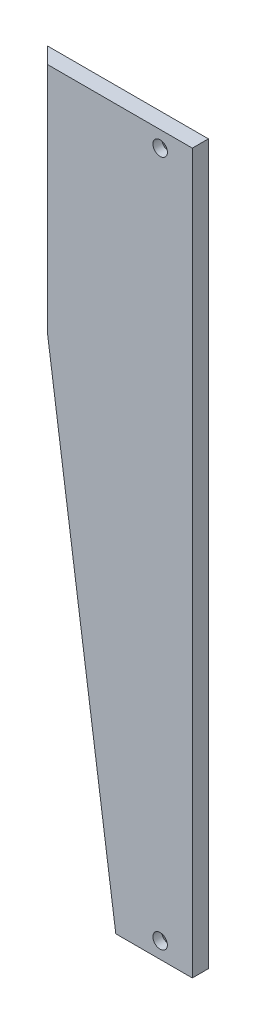
ISO-10303-21;
HEADER;
FILE_DESCRIPTION(('STEP AP214'),'2;1');
FILE_NAME('part.step','',(''),(''),'','','');
FILE_SCHEMA(('AUTOMOTIVE_DESIGN { 1 0 10303 214 1 1 1 1 }'));
ENDSEC;
DATA;
#1=APPLICATION_CONTEXT('core data for automotive mechanical design processes');
#2=APPLICATION_PROTOCOL_DEFINITION('international standard','automotive_design',2000,#1);
#3=PRODUCT_CONTEXT('',#1,'mechanical');
#4=PRODUCT('Part','Part','',(#3));
#5=PRODUCT_RELATED_PRODUCT_CATEGORY('part','',(#4));
#6=PRODUCT_DEFINITION_FORMATION('','',#4);
#7=PRODUCT_DEFINITION_CONTEXT('part definition',#1,'design');
#8=PRODUCT_DEFINITION('design','',#6,#7);
#9=PRODUCT_DEFINITION_SHAPE('','',#8);
#10=(LENGTH_UNIT() NAMED_UNIT(*) SI_UNIT(.MILLI.,.METRE.));
#11=(NAMED_UNIT(*) PLANE_ANGLE_UNIT() SI_UNIT($,.RADIAN.));
#12=(NAMED_UNIT(*) SI_UNIT($,.STERADIAN.) SOLID_ANGLE_UNIT());
#13=UNCERTAINTY_MEASURE_WITH_UNIT(LENGTH_MEASURE(1.E-05),#10,'distance_accuracy_value','');
#14=(GEOMETRIC_REPRESENTATION_CONTEXT(3) GLOBAL_UNCERTAINTY_ASSIGNED_CONTEXT((#13)) GLOBAL_UNIT_ASSIGNED_CONTEXT((#10,
#11,#12)) REPRESENTATION_CONTEXT('',''));
#15=CARTESIAN_POINT('',(0.,0.,0.));
#16=DIRECTION('',(0.,0.,1.));
#17=DIRECTION('',(1.,0.,0.));
#18=AXIS2_PLACEMENT_3D('',#15,#16,#17);
#19=CARTESIAN_POINT('',(0.,-447.,-10.));
#20=DIRECTION('',(-1.,0.,0.));
#21=DIRECTION('',(0.,0.,-1.));
#22=AXIS2_PLACEMENT_3D('',#19,#20,#21);
#23=PLANE('',#22);
#24=DIRECTION('',(0.,0.,1.));
#25=VECTOR('',#24,1.);
#26=CARTESIAN_POINT('',(0.,0.,-10.));
#27=LINE('',#26,#25);
#28=CARTESIAN_POINT('',(0.,0.,-10.));
#29=VERTEX_POINT('',#28);
#30=CARTESIAN_POINT('',(0.,0.,0.));
#31=VERTEX_POINT('',#30);
#32=EDGE_CURVE('E83',#29,#31,#27,.T.);
#33=ORIENTED_EDGE('',*,*,#32,.T.);
#34=DIRECTION('',(0.,1.,0.));
#35=VECTOR('',#34,1.);
#36=CARTESIAN_POINT('',(0.,-447.,0.));
#37=LINE('',#36,#35);
#38=CARTESIAN_POINT('',(0.,-447.,0.));
#39=VERTEX_POINT('',#38);
#40=EDGE_CURVE('E118',#39,#31,#37,.T.);
#41=ORIENTED_EDGE('',*,*,#40,.F.);
#42=DIRECTION('',(0.,0.,1.));
#43=VECTOR('',#42,1.);
#44=CARTESIAN_POINT('',(0.,-447.,-10.));
#45=LINE('',#44,#43);
#46=CARTESIAN_POINT('',(0.,-447.,-10.));
#47=VERTEX_POINT('',#46);
#48=EDGE_CURVE('E85',#47,#39,#45,.T.);
#49=ORIENTED_EDGE('',*,*,#48,.F.);
#50=DIRECTION('',(0.,1.,0.));
#51=VECTOR('',#50,1.);
#52=CARTESIAN_POINT('',(0.,-447.,-10.));
#53=LINE('',#52,#51);
#54=EDGE_CURVE('E79',#47,#29,#53,.T.);
#55=ORIENTED_EDGE('',*,*,#54,.T.);
#56=EDGE_LOOP('',(#33,#41,#49,#55));
#57=FACE_BOUND('',#56,.T.);
#58=ADVANCED_FACE('F32',(#57),#23,.F.);
#59=CARTESIAN_POINT('',(0.,0.,-10.));
#60=DIRECTION('',(0.,-1.,0.));
#61=DIRECTION('',(0.,0.,1.));
#62=AXIS2_PLACEMENT_3D('',#59,#60,#61);
#63=PLANE('',#62);
#64=DIRECTION('',(-1.,0.,0.));
#65=VECTOR('',#64,1.);
#66=CARTESIAN_POINT('',(0.,0.,0.));
#67=LINE('',#66,#65);
#68=CARTESIAN_POINT('',(-89.9999999999999,0.,0.));
#69=VERTEX_POINT('',#68);
#70=EDGE_CURVE('E101',#31,#69,#67,.T.);
#71=ORIENTED_EDGE('',*,*,#70,.F.);
#72=ORIENTED_EDGE('',*,*,#32,.F.);
#73=DIRECTION('',(-1.,0.,0.));
#74=VECTOR('',#73,1.);
#75=CARTESIAN_POINT('',(0.,0.,-10.));
#76=LINE('',#75,#74);
#77=CARTESIAN_POINT('',(-100.,0.,-10.));
#78=VERTEX_POINT('',#77);
#79=EDGE_CURVE('E88',#29,#78,#76,.T.);
#80=ORIENTED_EDGE('',*,*,#79,.T.);
#81=DIRECTION('',(0.707106781186549,0.,0.707106781186546));
#82=VECTOR('',#81,1.);
#83=CARTESIAN_POINT('',(-100.,0.,-10.));
#84=LINE('',#83,#82);
#85=EDGE_CURVE('E11',#69,#78,#84,.F.);
#86=ORIENTED_EDGE('',*,*,#85,.F.);
#87=EDGE_LOOP('',(#71,#72,#80,#86));
#88=FACE_BOUND('',#87,.T.);
#89=ADVANCED_FACE('F99',(#88),#63,.F.);
#90=CARTESIAN_POINT('',(-57.69720875458,-447.,-10.));
#91=DIRECTION('',(0.,1.,0.));
#92=DIRECTION('',(-1.,0.,0.));
#93=AXIS2_PLACEMENT_3D('',#90,#91,#92);
#94=PLANE('',#93);
#95=DIRECTION('',(1.,0.,0.));
#96=VECTOR('',#95,1.);
#97=CARTESIAN_POINT('',(-57.69720875458,-447.,-10.));
#98=LINE('',#97,#96);
#99=CARTESIAN_POINT('',(-57.69720875458,-447.,-10.));
#100=VERTEX_POINT('',#99);
#101=EDGE_CURVE('E106',#100,#47,#98,.T.);
#102=ORIENTED_EDGE('',*,*,#101,.T.);
#103=ORIENTED_EDGE('',*,*,#48,.T.);
#104=DIRECTION('',(1.,0.,0.));
#105=VECTOR('',#104,1.);
#106=CARTESIAN_POINT('',(-57.69720875458,-447.,0.));
#107=LINE('',#106,#105);
#108=CARTESIAN_POINT('',(-47.5989330293938,-447.,0.));
#109=VERTEX_POINT('',#108);
#110=EDGE_CURVE('E89',#109,#39,#107,.T.);
#111=ORIENTED_EDGE('',*,*,#110,.F.);
#112=DIRECTION('',(-0.710555868400576,0.,-0.703640787534025));
#113=VECTOR('',#112,1.);
#114=CARTESIAN_POINT('',(-79.0554498870937,-447.,-31.1503841980111));
#115=LINE('',#114,#113);
#116=EDGE_CURVE('E102',#100,#109,#115,.F.);
#117=ORIENTED_EDGE('',*,*,#116,.F.);
#118=EDGE_LOOP('',(#102,#103,#111,#117));
#119=FACE_BOUND('',#118,.T.);
#120=ADVANCED_FACE('F168',(#119),#94,.F.);
#121=CARTESIAN_POINT('',(0.,0.,-10.));
#122=DIRECTION('',(0.,0.,-1.));
#123=DIRECTION('',(1.,0.,0.));
#124=AXIS2_PLACEMENT_3D('',#121,#122,#123);
#125=PLANE('',#124);
#126=ORIENTED_EDGE('',*,*,#79,.F.);
#127=ORIENTED_EDGE('',*,*,#54,.F.);
#128=ORIENTED_EDGE('',*,*,#101,.F.);
#129=DIRECTION('',(0.139173100960066,-0.99026806874157,0.));
#130=VECTOR('',#129,1.);
#131=CARTESIAN_POINT('',(-100.,-146.,-10.));
#132=LINE('',#131,#130);
#133=CARTESIAN_POINT('',(-100.,-146.,-10.));
#134=VERTEX_POINT('',#133);
#135=EDGE_CURVE('E123',#134,#100,#132,.T.);
#136=ORIENTED_EDGE('',*,*,#135,.F.);
#137=DIRECTION('',(0.,-1.,0.));
#138=VECTOR('',#137,1.);
#139=CARTESIAN_POINT('',(-100.,0.,-10.));
#140=LINE('',#139,#138);
#141=EDGE_CURVE('E95',#78,#134,#140,.T.);
#142=ORIENTED_EDGE('',*,*,#141,.F.);
#143=EDGE_LOOP('',(#126,#127,#128,#136,#142));
#144=FACE_BOUND('',#143,.T.);
#145=CARTESIAN_POINT('',(-20.0000000000004,-10.,-10.));
#146=DIRECTION('',(0.,0.,1.));
#147=DIRECTION('',(1.,0.,0.));
#148=AXIS2_PLACEMENT_3D('',#145,#146,#147);
#149=CIRCLE('',#148,8.);
#150=CARTESIAN_POINT('',(-12.0000000000004,-10.,-10.));
#151=VERTEX_POINT('',#150);
#152=EDGE_CURVE('E147',#151,#151,#149,.T.);
#153=ORIENTED_EDGE('',*,*,#152,.T.);
#154=EDGE_LOOP('',(#153));
#155=FACE_BOUND('',#154,.T.);
#156=CARTESIAN_POINT('',(-19.9999999999972,-437.,-10.));
#157=DIRECTION('',(0.,0.,1.));
#158=DIRECTION('',(1.,0.,0.));
#159=AXIS2_PLACEMENT_3D('',#156,#157,#158);
#160=CIRCLE('',#159,8.);
#161=CARTESIAN_POINT('',(-11.9999999999972,-437.,-10.));
#162=VERTEX_POINT('',#161);
#163=EDGE_CURVE('E135',#162,#162,#160,.T.);
#164=ORIENTED_EDGE('',*,*,#163,.T.);
#165=EDGE_LOOP('',(#164));
#166=FACE_BOUND('',#165,.T.);
#167=ADVANCED_FACE('F92',(#144,#155,#166),#125,.T.);
#168=CARTESIAN_POINT('',(0.,0.,0.));
#169=DIRECTION('',(0.,0.,-1.));
#170=DIRECTION('',(1.,0.,0.));
#171=AXIS2_PLACEMENT_3D('',#168,#169,#170);
#172=PLANE('',#171);
#173=ORIENTED_EDGE('',*,*,#40,.T.);
#174=ORIENTED_EDGE('',*,*,#70,.T.);
#175=DIRECTION('',(0.,1.,0.));
#176=VECTOR('',#175,1.);
#177=CARTESIAN_POINT('',(-89.9999999999999,0.,0.));
#178=LINE('',#177,#176);
#179=CARTESIAN_POINT('',(-89.9999999999999,-145.300731880565,0.));
#180=VERTEX_POINT('',#179);
#181=EDGE_CURVE('E51',#180,#69,#178,.T.);
#182=ORIENTED_EDGE('',*,*,#181,.F.);
#183=DIRECTION('',(-0.139173100960066,0.99026806874157,0.));
#184=VECTOR('',#183,1.);
#185=CARTESIAN_POINT('',(-108.281931084141,-15.2180329777521,0.));
#186=LINE('',#185,#184);
#187=EDGE_CURVE('E41',#109,#180,#186,.T.);
#188=ORIENTED_EDGE('',*,*,#187,.F.);
#189=ORIENTED_EDGE('',*,*,#110,.T.);
#190=EDGE_LOOP('',(#173,#174,#182,#188,#189));
#191=FACE_BOUND('',#190,.T.);
#192=CARTESIAN_POINT('',(-20.0000000000004,-10.,0.));
#193=DIRECTION('',(0.,0.,1.));
#194=DIRECTION('',(1.,0.,0.));
#195=AXIS2_PLACEMENT_3D('',#192,#193,#194);
#196=CIRCLE('',#195,4.50000000000001);
#197=CARTESIAN_POINT('',(-15.5000000000004,-10.,0.));
#198=VERTEX_POINT('',#197);
#199=EDGE_CURVE('E138',#198,#198,#196,.T.);
#200=ORIENTED_EDGE('',*,*,#199,.F.);
#201=EDGE_LOOP('',(#200));
#202=FACE_BOUND('',#201,.T.);
#203=CARTESIAN_POINT('',(-19.9999999999972,-437.,0.));
#204=DIRECTION('',(0.,0.,1.));
#205=DIRECTION('',(1.,0.,0.));
#206=AXIS2_PLACEMENT_3D('',#203,#204,#205);
#207=CIRCLE('',#206,4.50000000000001);
#208=CARTESIAN_POINT('',(-15.4999999999972,-437.,0.));
#209=VERTEX_POINT('',#208);
#210=EDGE_CURVE('E126',#209,#209,#207,.T.);
#211=ORIENTED_EDGE('',*,*,#210,.F.);
#212=EDGE_LOOP('',(#211));
#213=FACE_BOUND('',#212,.T.);
#214=ADVANCED_FACE('F116',(#191,#202,#213),#172,.F.);
#215=CARTESIAN_POINT('',(-100.,0.,-10.));
#216=DIRECTION('',(0.707106781186545,0.,-0.707106781186549));
#217=DIRECTION('',(0.,-1.,0.));
#218=AXIS2_PLACEMENT_3D('',#215,#216,#217);
#219=PLANE('',#218);
#220=ORIENTED_EDGE('',*,*,#85,.T.);
#221=ORIENTED_EDGE('',*,*,#141,.T.);
#222=DIRECTION('',(-0.706243967529311,-0.0493853891036542,-0.706243967529308));
#223=VECTOR('',#222,1.);
#224=CARTESIAN_POINT('',(-94.9077925617726,-145.64391816809,-4.90779256177268));
#225=LINE('',#224,#223);
#226=EDGE_CURVE('E36',#134,#180,#225,.F.);
#227=ORIENTED_EDGE('',*,*,#226,.T.);
#228=ORIENTED_EDGE('',*,*,#181,.T.);
#229=EDGE_LOOP('',(#220,#221,#227,#228));
#230=FACE_BOUND('',#229,.T.);
#231=ADVANCED_FACE('F34',(#230),#219,.F.);
#232=CARTESIAN_POINT('',(-100.,-146.,-10.));
#233=DIRECTION('',(0.700225266599669,0.0984102434476225,-0.707106781186549));
#234=DIRECTION('',(0.139173100960066,-0.99026806874157,0.));
#235=AXIS2_PLACEMENT_3D('',#232,#233,#234);
#236=PLANE('',#235);
#237=ORIENTED_EDGE('',*,*,#226,.F.);
#238=ORIENTED_EDGE('',*,*,#135,.T.);
#239=ORIENTED_EDGE('',*,*,#116,.T.);
#240=ORIENTED_EDGE('',*,*,#187,.T.);
#241=EDGE_LOOP('',(#237,#238,#239,#240));
#242=FACE_BOUND('',#241,.T.);
#243=ADVANCED_FACE('F112',(#242),#236,.F.);
#244=CARTESIAN_POINT('',(-19.9999999999972,-437.,-10.));
#245=DIRECTION('',(0.,0.,-1.));
#246=DIRECTION('',(1.,0.,0.));
#247=AXIS2_PLACEMENT_3D('',#244,#245,#246);
#248=CYLINDRICAL_SURFACE('',#247,4.50000000000001);
#249=ORIENTED_EDGE('',*,*,#210,.T.);
#250=EDGE_LOOP('',(#249));
#251=FACE_BOUND('',#250,.T.);
#252=CARTESIAN_POINT('',(-19.9999999999972,-437.,-5.5));
#253=DIRECTION('',(0.,0.,1.));
#254=DIRECTION('',(1.,0.,0.));
#255=AXIS2_PLACEMENT_3D('',#252,#253,#254);
#256=CIRCLE('',#255,4.5);
#257=CARTESIAN_POINT('',(-15.4999999999972,-437.,-5.5));
#258=VERTEX_POINT('',#257);
#259=EDGE_CURVE('E129',#258,#258,#256,.T.);
#260=ORIENTED_EDGE('',*,*,#259,.F.);
#261=EDGE_LOOP('',(#260));
#262=FACE_BOUND('',#261,.T.);
#263=ADVANCED_FACE('F172',(#251,#262),#248,.F.);
#264=CARTESIAN_POINT('',(-19.9999999999972,-437.,-9.));
#265=DIRECTION('',(0.,0.,-1.));
#266=DIRECTION('',(1.,0.,0.));
#267=AXIS2_PLACEMENT_3D('',#264,#265,#266);
#268=CONICAL_SURFACE('',#267,8.,0.785398163397449);
#269=ORIENTED_EDGE('',*,*,#259,.T.);
#270=EDGE_LOOP('',(#269));
#271=FACE_BOUND('',#270,.T.);
#272=CARTESIAN_POINT('',(-19.9999999999972,-437.,-9.));
#273=DIRECTION('',(0.,0.,1.));
#274=DIRECTION('',(1.,0.,0.));
#275=AXIS2_PLACEMENT_3D('',#272,#273,#274);
#276=CIRCLE('',#275,8.);
#277=CARTESIAN_POINT('',(-11.9999999999972,-437.,-9.));
#278=VERTEX_POINT('',#277);
#279=EDGE_CURVE('E132',#278,#278,#276,.T.);
#280=ORIENTED_EDGE('',*,*,#279,.F.);
#281=EDGE_LOOP('',(#280));
#282=FACE_BOUND('',#281,.T.);
#283=ADVANCED_FACE('F177',(#271,#282),#268,.F.);
#284=CARTESIAN_POINT('',(-19.9999999999972,-437.,-10.));
#285=DIRECTION('',(0.,0.,-1.));
#286=DIRECTION('',(1.,0.,0.));
#287=AXIS2_PLACEMENT_3D('',#284,#285,#286);
#288=CYLINDRICAL_SURFACE('',#287,8.);
#289=ORIENTED_EDGE('',*,*,#279,.T.);
#290=EDGE_LOOP('',(#289));
#291=FACE_BOUND('',#290,.T.);
#292=ORIENTED_EDGE('',*,*,#163,.F.);
#293=EDGE_LOOP('',(#292));
#294=FACE_BOUND('',#293,.T.);
#295=ADVANCED_FACE('F193',(#291,#294),#288,.F.);
#296=CARTESIAN_POINT('',(-20.0000000000004,-10.,-10.));
#297=DIRECTION('',(0.,0.,-1.));
#298=DIRECTION('',(1.,0.,0.));
#299=AXIS2_PLACEMENT_3D('',#296,#297,#298);
#300=CYLINDRICAL_SURFACE('',#299,4.50000000000001);
#301=ORIENTED_EDGE('',*,*,#199,.T.);
#302=EDGE_LOOP('',(#301));
#303=FACE_BOUND('',#302,.T.);
#304=CARTESIAN_POINT('',(-20.0000000000004,-10.,-5.5));
#305=DIRECTION('',(0.,0.,1.));
#306=DIRECTION('',(1.,0.,0.));
#307=AXIS2_PLACEMENT_3D('',#304,#305,#306);
#308=CIRCLE('',#307,4.5);
#309=CARTESIAN_POINT('',(-15.5000000000004,-10.,-5.5));
#310=VERTEX_POINT('',#309);
#311=EDGE_CURVE('E141',#310,#310,#308,.T.);
#312=ORIENTED_EDGE('',*,*,#311,.F.);
#313=EDGE_LOOP('',(#312));
#314=FACE_BOUND('',#313,.T.);
#315=ADVANCED_FACE('F160',(#303,#314),#300,.F.);
#316=CARTESIAN_POINT('',(-20.0000000000004,-10.,-9.));
#317=DIRECTION('',(0.,0.,-1.));
#318=DIRECTION('',(1.,0.,0.));
#319=AXIS2_PLACEMENT_3D('',#316,#317,#318);
#320=CONICAL_SURFACE('',#319,8.,0.785398163397449);
#321=ORIENTED_EDGE('',*,*,#311,.T.);
#322=EDGE_LOOP('',(#321));
#323=FACE_BOUND('',#322,.T.);
#324=CARTESIAN_POINT('',(-20.0000000000004,-10.,-9.));
#325=DIRECTION('',(0.,0.,1.));
#326=DIRECTION('',(1.,0.,0.));
#327=AXIS2_PLACEMENT_3D('',#324,#325,#326);
#328=CIRCLE('',#327,8.);
#329=CARTESIAN_POINT('',(-12.0000000000004,-10.,-9.));
#330=VERTEX_POINT('',#329);
#331=EDGE_CURVE('E144',#330,#330,#328,.T.);
#332=ORIENTED_EDGE('',*,*,#331,.F.);
#333=EDGE_LOOP('',(#332));
#334=FACE_BOUND('',#333,.T.);
#335=ADVANCED_FACE('F154',(#323,#334),#320,.F.);
#336=CARTESIAN_POINT('',(-20.0000000000004,-10.,-10.));
#337=DIRECTION('',(0.,0.,-1.));
#338=DIRECTION('',(1.,0.,0.));
#339=AXIS2_PLACEMENT_3D('',#336,#337,#338);
#340=CYLINDRICAL_SURFACE('',#339,8.);
#341=ORIENTED_EDGE('',*,*,#331,.T.);
#342=EDGE_LOOP('',(#341));
#343=FACE_BOUND('',#342,.T.);
#344=ORIENTED_EDGE('',*,*,#152,.F.);
#345=EDGE_LOOP('',(#344));
#346=FACE_BOUND('',#345,.T.);
#347=ADVANCED_FACE('F152',(#343,#346),#340,.F.);
#348=CLOSED_SHELL('',(#58,#89,#120,#167,#214,#231,#243,#263,#283,#295,#315,#335,#347));
#349=MANIFOLD_SOLID_BREP('B2',#348);
#350=ADVANCED_BREP_SHAPE_REPRESENTATION('',(#18,#349),#14);
#351=SHAPE_DEFINITION_REPRESENTATION(#9,#350);
ENDSEC;
END-ISO-10303-21;
